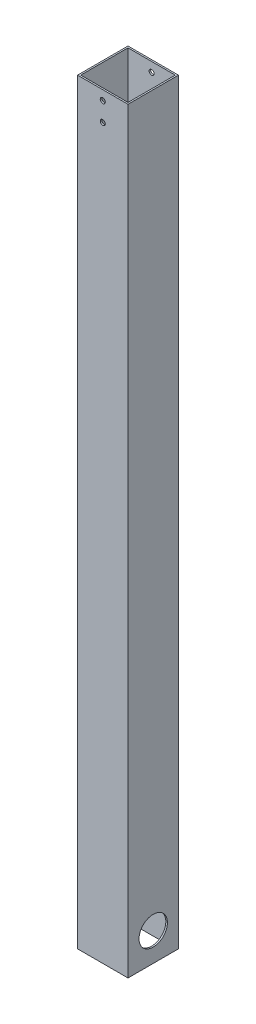
ISO-10303-21;
HEADER;
FILE_DESCRIPTION(('STEP AP214'),'2;1');
FILE_NAME('part.step','',(''),(''),'','','');
FILE_SCHEMA(('AUTOMOTIVE_DESIGN { 1 0 10303 214 1 1 1 1 }'));
ENDSEC;
DATA;
#1=APPLICATION_CONTEXT('core data for automotive mechanical design processes');
#2=APPLICATION_PROTOCOL_DEFINITION('international standard','automotive_design',2000,#1);
#3=PRODUCT_CONTEXT('',#1,'mechanical');
#4=PRODUCT('Part','Part','',(#3));
#5=PRODUCT_RELATED_PRODUCT_CATEGORY('part','',(#4));
#6=PRODUCT_DEFINITION_FORMATION('','',#4);
#7=PRODUCT_DEFINITION_CONTEXT('part definition',#1,'design');
#8=PRODUCT_DEFINITION('design','',#6,#7);
#9=PRODUCT_DEFINITION_SHAPE('','',#8);
#10=(LENGTH_UNIT() NAMED_UNIT(*) SI_UNIT(.MILLI.,.METRE.));
#11=(NAMED_UNIT(*) PLANE_ANGLE_UNIT() SI_UNIT($,.RADIAN.));
#12=(NAMED_UNIT(*) SI_UNIT($,.STERADIAN.) SOLID_ANGLE_UNIT());
#13=UNCERTAINTY_MEASURE_WITH_UNIT(LENGTH_MEASURE(1.E-05),#10,'distance_accuracy_value','');
#14=(GEOMETRIC_REPRESENTATION_CONTEXT(3) GLOBAL_UNCERTAINTY_ASSIGNED_CONTEXT((#13)) GLOBAL_UNIT_ASSIGNED_CONTEXT((#10,
#11,#12)) REPRESENTATION_CONTEXT('',''));
#15=CARTESIAN_POINT('',(0.,0.,0.));
#16=DIRECTION('',(0.,0.,1.));
#17=DIRECTION('',(1.,0.,0.));
#18=AXIS2_PLACEMENT_3D('',#15,#16,#17);
#19=CARTESIAN_POINT('',(0.,752.475,-25.4));
#20=DIRECTION('',(0.,0.,1.));
#21=DIRECTION('',(1.,0.,0.));
#22=AXIS2_PLACEMENT_3D('',#19,#20,#21);
#23=CYLINDRICAL_SURFACE('',#22,2.55270000000007);
#24=CARTESIAN_POINT('',(0.,752.475,25.4));
#25=DIRECTION('',(0.,0.,1.));
#26=DIRECTION('',(1.,0.,0.));
#27=AXIS2_PLACEMENT_3D('',#24,#25,#26);
#28=CIRCLE('',#27,2.55270000000007);
#29=CARTESIAN_POINT('',(2.55270000000007,752.475,25.4));
#30=VERTEX_POINT('',#29);
#31=EDGE_CURVE('E179',#30,#30,#28,.T.);
#32=ORIENTED_EDGE('',*,*,#31,.T.);
#33=EDGE_LOOP('',(#32));
#34=FACE_BOUND('',#33,.T.);
#35=CARTESIAN_POINT('',(0.,752.475,23.8125));
#36=DIRECTION('',(0.,0.,1.));
#37=DIRECTION('',(1.,0.,0.));
#38=AXIS2_PLACEMENT_3D('',#35,#36,#37);
#39=CIRCLE('',#38,2.55270000000007);
#40=CARTESIAN_POINT('',(2.55270000000007,752.475,23.8125));
#41=VERTEX_POINT('',#40);
#42=EDGE_CURVE('E164',#41,#41,#39,.T.);
#43=ORIENTED_EDGE('',*,*,#42,.F.);
#44=EDGE_LOOP('',(#43));
#45=FACE_BOUND('',#44,.T.);
#46=ADVANCED_FACE('F17',(#34,#45),#23,.F.);
#47=CARTESIAN_POINT('',(2.0643209364124E-13,733.425,-25.4));
#48=DIRECTION('',(0.,0.,1.));
#49=DIRECTION('',(1.,0.,0.));
#50=AXIS2_PLACEMENT_3D('',#47,#48,#49);
#51=CYLINDRICAL_SURFACE('',#50,2.55270000000007);
#52=CARTESIAN_POINT('',(2.0643209364124E-13,733.425,25.4));
#53=DIRECTION('',(0.,0.,1.));
#54=DIRECTION('',(1.,0.,0.));
#55=AXIS2_PLACEMENT_3D('',#52,#53,#54);
#56=CIRCLE('',#55,2.55270000000007);
#57=CARTESIAN_POINT('',(2.55270000000027,733.425,25.4));
#58=VERTEX_POINT('',#57);
#59=EDGE_CURVE('E174',#58,#58,#56,.T.);
#60=ORIENTED_EDGE('',*,*,#59,.T.);
#61=EDGE_LOOP('',(#60));
#62=FACE_BOUND('',#61,.T.);
#63=CARTESIAN_POINT('',(2.0643209364124E-13,733.425,23.8125));
#64=DIRECTION('',(0.,0.,1.));
#65=DIRECTION('',(1.,0.,0.));
#66=AXIS2_PLACEMENT_3D('',#63,#64,#65);
#67=CIRCLE('',#66,2.55270000000007);
#68=CARTESIAN_POINT('',(2.55270000000027,733.425,23.8125));
#69=VERTEX_POINT('',#68);
#70=EDGE_CURVE('E126',#69,#69,#67,.T.);
#71=ORIENTED_EDGE('',*,*,#70,.F.);
#72=EDGE_LOOP('',(#71));
#73=FACE_BOUND('',#72,.T.);
#74=ADVANCED_FACE('F248',(#62,#73),#51,.F.);
#75=CARTESIAN_POINT('',(25.4,28.575,0.));
#76=DIRECTION('',(-1.,0.,0.));
#77=DIRECTION('',(0.,0.,1.));
#78=AXIS2_PLACEMENT_3D('',#75,#76,#77);
#79=CYLINDRICAL_SURFACE('',#78,14.2875);
#80=CARTESIAN_POINT('',(25.4,28.575,0.));
#81=DIRECTION('',(-1.,0.,0.));
#82=DIRECTION('',(0.,0.,1.));
#83=AXIS2_PLACEMENT_3D('',#80,#81,#82);
#84=CIRCLE('',#83,14.2875);
#85=CARTESIAN_POINT('',(25.4,28.575,14.2875));
#86=VERTEX_POINT('',#85);
#87=EDGE_CURVE('E118',#86,#86,#84,.F.);
#88=ORIENTED_EDGE('',*,*,#87,.T.);
#89=EDGE_LOOP('',(#88));
#90=FACE_BOUND('',#89,.T.);
#91=CARTESIAN_POINT('',(23.8125,28.575,0.));
#92=DIRECTION('',(-1.,0.,0.));
#93=DIRECTION('',(0.,0.,1.));
#94=AXIS2_PLACEMENT_3D('',#91,#92,#93);
#95=CIRCLE('',#94,14.2875);
#96=CARTESIAN_POINT('',(23.8125,28.575,14.2875));
#97=VERTEX_POINT('',#96);
#98=EDGE_CURVE('E169',#97,#97,#95,.F.);
#99=ORIENTED_EDGE('',*,*,#98,.F.);
#100=EDGE_LOOP('',(#99));
#101=FACE_BOUND('',#100,.T.);
#102=ADVANCED_FACE('F200',(#90,#101),#79,.F.);
#103=CARTESIAN_POINT('',(25.4,28.575,0.));
#104=DIRECTION('',(-1.,0.,0.));
#105=DIRECTION('',(0.,0.,1.));
#106=AXIS2_PLACEMENT_3D('',#103,#104,#105);
#107=CYLINDRICAL_SURFACE('',#106,14.2875);
#108=CARTESIAN_POINT('',(-25.4,28.575,0.));
#109=DIRECTION('',(-1.,0.,0.));
#110=DIRECTION('',(0.,0.,1.));
#111=AXIS2_PLACEMENT_3D('',#108,#109,#110);
#112=CIRCLE('',#111,14.2875);
#113=CARTESIAN_POINT('',(-25.4,28.575,14.2875));
#114=VERTEX_POINT('',#113);
#115=EDGE_CURVE('E139',#114,#114,#112,.T.);
#116=ORIENTED_EDGE('',*,*,#115,.T.);
#117=EDGE_LOOP('',(#116));
#118=FACE_BOUND('',#117,.T.);
#119=CARTESIAN_POINT('',(-23.8125,28.575,0.));
#120=DIRECTION('',(-1.,0.,0.));
#121=DIRECTION('',(0.,0.,1.));
#122=AXIS2_PLACEMENT_3D('',#119,#120,#121);
#123=CIRCLE('',#122,14.2875);
#124=CARTESIAN_POINT('',(-23.8125,28.575,14.2875));
#125=VERTEX_POINT('',#124);
#126=EDGE_CURVE('E123',#125,#125,#123,.T.);
#127=ORIENTED_EDGE('',*,*,#126,.F.);
#128=EDGE_LOOP('',(#127));
#129=FACE_BOUND('',#128,.T.);
#130=ADVANCED_FACE('F189',(#118,#129),#107,.F.);
#131=CARTESIAN_POINT('',(-25.4,762.,25.4));
#132=DIRECTION('',(0.,0.,-1.));
#133=DIRECTION('',(-1.,0.,0.));
#134=AXIS2_PLACEMENT_3D('',#131,#132,#133);
#135=PLANE('',#134);
#136=DIRECTION('',(0.,1.,0.));
#137=VECTOR('',#136,1.);
#138=CARTESIAN_POINT('',(25.4,762.,25.4));
#139=LINE('',#138,#137);
#140=CARTESIAN_POINT('',(25.4,0.,25.4));
#141=VERTEX_POINT('',#140);
#142=CARTESIAN_POINT('',(25.4,762.,25.4));
#143=VERTEX_POINT('',#142);
#144=EDGE_CURVE('E116',#141,#143,#139,.T.);
#145=ORIENTED_EDGE('',*,*,#144,.T.);
#146=DIRECTION('',(1.,0.,0.));
#147=VECTOR('',#146,1.);
#148=CARTESIAN_POINT('',(0.,762.,25.4));
#149=LINE('',#148,#147);
#150=CARTESIAN_POINT('',(-25.4,762.,25.4));
#151=VERTEX_POINT('',#150);
#152=EDGE_CURVE('E90',#151,#143,#149,.T.);
#153=ORIENTED_EDGE('',*,*,#152,.F.);
#154=DIRECTION('',(0.,1.,0.));
#155=VECTOR('',#154,1.);
#156=CARTESIAN_POINT('',(-25.4,762.,25.4));
#157=LINE('',#156,#155);
#158=CARTESIAN_POINT('',(-25.4,0.,25.4));
#159=VERTEX_POINT('',#158);
#160=EDGE_CURVE('E369',#151,#159,#157,.F.);
#161=ORIENTED_EDGE('',*,*,#160,.T.);
#162=DIRECTION('',(1.,0.,0.));
#163=VECTOR('',#162,1.);
#164=CARTESIAN_POINT('',(0.,0.,25.4));
#165=LINE('',#164,#163);
#166=EDGE_CURVE('E372',#159,#141,#165,.T.);
#167=ORIENTED_EDGE('',*,*,#166,.T.);
#168=EDGE_LOOP('',(#145,#153,#161,#167));
#169=FACE_BOUND('',#168,.T.);
#170=ORIENTED_EDGE('',*,*,#59,.F.);
#171=EDGE_LOOP('',(#170));
#172=FACE_BOUND('',#171,.T.);
#173=ORIENTED_EDGE('',*,*,#31,.F.);
#174=EDGE_LOOP('',(#173));
#175=FACE_BOUND('',#174,.T.);
#176=ADVANCED_FACE('F186',(#169,#172,#175),#135,.F.);
#177=CARTESIAN_POINT('',(23.8125,762.,-23.8125));
#178=DIRECTION('',(-1.,0.,0.));
#179=DIRECTION('',(0.,0.,1.));
#180=AXIS2_PLACEMENT_3D('',#177,#178,#179);
#181=PLANE('',#180);
#182=DIRECTION('',(0.,0.,1.));
#183=VECTOR('',#182,1.);
#184=CARTESIAN_POINT('',(23.8125,762.,0.));
#185=LINE('',#184,#183);
#186=CARTESIAN_POINT('',(23.8125,762.,-23.8125));
#187=VERTEX_POINT('',#186);
#188=CARTESIAN_POINT('',(23.8125,762.,23.8125));
#189=VERTEX_POINT('',#188);
#190=EDGE_CURVE('E107',#187,#189,#185,.T.);
#191=ORIENTED_EDGE('',*,*,#190,.F.);
#192=DIRECTION('',(0.,1.,0.));
#193=VECTOR('',#192,1.);
#194=CARTESIAN_POINT('',(23.8125,762.,-23.8125));
#195=LINE('',#194,#193);
#196=CARTESIAN_POINT('',(23.8125,0.,-23.8125));
#197=VERTEX_POINT('',#196);
#198=EDGE_CURVE('E102',#197,#187,#195,.T.);
#199=ORIENTED_EDGE('',*,*,#198,.F.);
#200=DIRECTION('',(0.,0.,1.));
#201=VECTOR('',#200,1.);
#202=CARTESIAN_POINT('',(23.8125,0.,0.));
#203=LINE('',#202,#201);
#204=CARTESIAN_POINT('',(23.8125,0.,23.8125));
#205=VERTEX_POINT('',#204);
#206=EDGE_CURVE('E378',#197,#205,#203,.T.);
#207=ORIENTED_EDGE('',*,*,#206,.T.);
#208=DIRECTION('',(0.,1.,0.));
#209=VECTOR('',#208,1.);
#210=CARTESIAN_POINT('',(23.8125,762.,23.8125));
#211=LINE('',#210,#209);
#212=EDGE_CURVE('E124',#189,#205,#211,.F.);
#213=ORIENTED_EDGE('',*,*,#212,.F.);
#214=EDGE_LOOP('',(#191,#199,#207,#213));
#215=FACE_BOUND('',#214,.T.);
#216=ORIENTED_EDGE('',*,*,#98,.T.);
#217=EDGE_LOOP('',(#216));
#218=FACE_BOUND('',#217,.T.);
#219=ADVANCED_FACE('F188',(#215,#218),#181,.T.);
#220=CARTESIAN_POINT('',(-23.8125,762.,23.8125));
#221=DIRECTION('',(0.,0.,-1.));
#222=DIRECTION('',(-1.,0.,0.));
#223=AXIS2_PLACEMENT_3D('',#220,#221,#222);
#224=PLANE('',#223);
#225=DIRECTION('',(1.,0.,0.));
#226=VECTOR('',#225,1.);
#227=CARTESIAN_POINT('',(0.,762.,23.8125));
#228=LINE('',#227,#226);
#229=CARTESIAN_POINT('',(-23.8125,762.,23.8125));
#230=VERTEX_POINT('',#229);
#231=EDGE_CURVE('E88',#189,#230,#228,.F.);
#232=ORIENTED_EDGE('',*,*,#231,.F.);
#233=ORIENTED_EDGE('',*,*,#212,.T.);
#234=DIRECTION('',(1.,0.,0.));
#235=VECTOR('',#234,1.);
#236=CARTESIAN_POINT('',(0.,0.,23.8125));
#237=LINE('',#236,#235);
#238=CARTESIAN_POINT('',(-23.8125,0.,23.8125));
#239=VERTEX_POINT('',#238);
#240=EDGE_CURVE('E381',#205,#239,#237,.F.);
#241=ORIENTED_EDGE('',*,*,#240,.T.);
#242=DIRECTION('',(0.,1.,0.));
#243=VECTOR('',#242,1.);
#244=CARTESIAN_POINT('',(-23.8125,762.,23.8125));
#245=LINE('',#244,#243);
#246=EDGE_CURVE('E121',#230,#239,#245,.F.);
#247=ORIENTED_EDGE('',*,*,#246,.F.);
#248=EDGE_LOOP('',(#232,#233,#241,#247));
#249=FACE_BOUND('',#248,.T.);
#250=ORIENTED_EDGE('',*,*,#70,.T.);
#251=EDGE_LOOP('',(#250));
#252=FACE_BOUND('',#251,.T.);
#253=ORIENTED_EDGE('',*,*,#42,.T.);
#254=EDGE_LOOP('',(#253));
#255=FACE_BOUND('',#254,.T.);
#256=ADVANCED_FACE('F197',(#249,#252,#255),#224,.T.);
#257=CARTESIAN_POINT('',(-23.8125,762.,-23.8125));
#258=DIRECTION('',(1.,0.,0.));
#259=DIRECTION('',(0.,0.,-1.));
#260=AXIS2_PLACEMENT_3D('',#257,#258,#259);
#261=PLANE('',#260);
#262=DIRECTION('',(0.,0.,1.));
#263=VECTOR('',#262,1.);
#264=CARTESIAN_POINT('',(-23.8125,762.,0.));
#265=LINE('',#264,#263);
#266=CARTESIAN_POINT('',(-23.8125,762.,-23.8125));
#267=VERTEX_POINT('',#266);
#268=EDGE_CURVE('E80',#230,#267,#265,.F.);
#269=ORIENTED_EDGE('',*,*,#268,.F.);
#270=ORIENTED_EDGE('',*,*,#246,.T.);
#271=DIRECTION('',(0.,0.,1.));
#272=VECTOR('',#271,1.);
#273=CARTESIAN_POINT('',(-23.8125,0.,0.));
#274=LINE('',#273,#272);
#275=CARTESIAN_POINT('',(-23.8125,0.,-23.8125));
#276=VERTEX_POINT('',#275);
#277=EDGE_CURVE('E97',#239,#276,#274,.F.);
#278=ORIENTED_EDGE('',*,*,#277,.T.);
#279=DIRECTION('',(0.,1.,0.));
#280=VECTOR('',#279,1.);
#281=CARTESIAN_POINT('',(-23.8125,762.,-23.8125));
#282=LINE('',#281,#280);
#283=EDGE_CURVE('E93',#267,#276,#282,.F.);
#284=ORIENTED_EDGE('',*,*,#283,.F.);
#285=EDGE_LOOP('',(#269,#270,#278,#284));
#286=FACE_BOUND('',#285,.T.);
#287=ORIENTED_EDGE('',*,*,#126,.T.);
#288=EDGE_LOOP('',(#287));
#289=FACE_BOUND('',#288,.T.);
#290=ADVANCED_FACE('F94',(#286,#289),#261,.T.);
#291=CARTESIAN_POINT('',(-23.8125,762.,-23.8125));
#292=DIRECTION('',(0.,0.,1.));
#293=DIRECTION('',(1.,0.,0.));
#294=AXIS2_PLACEMENT_3D('',#291,#292,#293);
#295=PLANE('',#294);
#296=DIRECTION('',(1.,0.,0.));
#297=VECTOR('',#296,1.);
#298=CARTESIAN_POINT('',(0.,762.,-23.8125));
#299=LINE('',#298,#297);
#300=EDGE_CURVE('E85',#267,#187,#299,.T.);
#301=ORIENTED_EDGE('',*,*,#300,.F.);
#302=ORIENTED_EDGE('',*,*,#283,.T.);
#303=DIRECTION('',(1.,0.,0.));
#304=VECTOR('',#303,1.);
#305=CARTESIAN_POINT('',(0.,0.,-23.8125));
#306=LINE('',#305,#304);
#307=EDGE_CURVE('E136',#276,#197,#306,.T.);
#308=ORIENTED_EDGE('',*,*,#307,.T.);
#309=ORIENTED_EDGE('',*,*,#198,.T.);
#310=EDGE_LOOP('',(#301,#302,#308,#309));
#311=FACE_BOUND('',#310,.T.);
#312=CARTESIAN_POINT('',(2.0643209364124E-13,733.425,-23.8125));
#313=DIRECTION('',(0.,0.,1.));
#314=DIRECTION('',(1.,0.,0.));
#315=AXIS2_PLACEMENT_3D('',#312,#313,#314);
#316=CIRCLE('',#315,2.55270000000007);
#317=CARTESIAN_POINT('',(2.55270000000027,733.425,-23.8125));
#318=VERTEX_POINT('',#317);
#319=EDGE_CURVE('E147',#318,#318,#316,.F.);
#320=ORIENTED_EDGE('',*,*,#319,.T.);
#321=EDGE_LOOP('',(#320));
#322=FACE_BOUND('',#321,.T.);
#323=CARTESIAN_POINT('',(0.,752.475,-23.8125));
#324=DIRECTION('',(0.,0.,1.));
#325=DIRECTION('',(1.,0.,0.));
#326=AXIS2_PLACEMENT_3D('',#323,#324,#325);
#327=CIRCLE('',#326,2.55270000000007);
#328=CARTESIAN_POINT('',(2.55270000000007,752.475,-23.8125));
#329=VERTEX_POINT('',#328);
#330=EDGE_CURVE('E101',#329,#329,#327,.F.);
#331=ORIENTED_EDGE('',*,*,#330,.T.);
#332=EDGE_LOOP('',(#331));
#333=FACE_BOUND('',#332,.T.);
#334=ADVANCED_FACE('F104',(#311,#322,#333),#295,.T.);
#335=CARTESIAN_POINT('',(0.,752.475,-25.4));
#336=DIRECTION('',(0.,0.,1.));
#337=DIRECTION('',(1.,0.,0.));
#338=AXIS2_PLACEMENT_3D('',#335,#336,#337);
#339=CYLINDRICAL_SURFACE('',#338,2.55270000000007);
#340=CARTESIAN_POINT('',(0.,752.475,-25.4));
#341=DIRECTION('',(0.,0.,1.));
#342=DIRECTION('',(1.,0.,0.));
#343=AXIS2_PLACEMENT_3D('',#340,#341,#342);
#344=CIRCLE('',#343,2.55270000000007);
#345=CARTESIAN_POINT('',(2.55270000000007,752.475,-25.4));
#346=VERTEX_POINT('',#345);
#347=EDGE_CURVE('E131',#346,#346,#344,.F.);
#348=ORIENTED_EDGE('',*,*,#347,.T.);
#349=EDGE_LOOP('',(#348));
#350=FACE_BOUND('',#349,.T.);
#351=ORIENTED_EDGE('',*,*,#330,.F.);
#352=EDGE_LOOP('',(#351));
#353=FACE_BOUND('',#352,.T.);
#354=ADVANCED_FACE('F230',(#350,#353),#339,.F.);
#355=CARTESIAN_POINT('',(2.0643209364124E-13,733.425,-25.4));
#356=DIRECTION('',(0.,0.,1.));
#357=DIRECTION('',(1.,0.,0.));
#358=AXIS2_PLACEMENT_3D('',#355,#356,#357);
#359=CYLINDRICAL_SURFACE('',#358,2.55270000000007);
#360=CARTESIAN_POINT('',(2.0643209364124E-13,733.425,-25.4));
#361=DIRECTION('',(0.,0.,1.));
#362=DIRECTION('',(1.,0.,0.));
#363=AXIS2_PLACEMENT_3D('',#360,#361,#362);
#364=CIRCLE('',#363,2.55270000000007);
#365=CARTESIAN_POINT('',(2.55270000000027,733.425,-25.4));
#366=VERTEX_POINT('',#365);
#367=EDGE_CURVE('E127',#366,#366,#364,.F.);
#368=ORIENTED_EDGE('',*,*,#367,.T.);
#369=EDGE_LOOP('',(#368));
#370=FACE_BOUND('',#369,.T.);
#371=ORIENTED_EDGE('',*,*,#319,.F.);
#372=EDGE_LOOP('',(#371));
#373=FACE_BOUND('',#372,.T.);
#374=ADVANCED_FACE('F226',(#370,#373),#359,.F.);
#375=CARTESIAN_POINT('',(25.4,762.,-25.4));
#376=DIRECTION('',(-1.,0.,0.));
#377=DIRECTION('',(0.,0.,1.));
#378=AXIS2_PLACEMENT_3D('',#375,#376,#377);
#379=PLANE('',#378);
#380=DIRECTION('',(0.,1.,0.));
#381=VECTOR('',#380,1.);
#382=CARTESIAN_POINT('',(25.4,762.,-25.4));
#383=LINE('',#382,#381);
#384=CARTESIAN_POINT('',(25.4,0.,-25.4));
#385=VERTEX_POINT('',#384);
#386=CARTESIAN_POINT('',(25.4,762.,-25.4));
#387=VERTEX_POINT('',#386);
#388=EDGE_CURVE('E130',#385,#387,#383,.T.);
#389=ORIENTED_EDGE('',*,*,#388,.T.);
#390=DIRECTION('',(0.,0.,1.));
#391=VECTOR('',#390,1.);
#392=CARTESIAN_POINT('',(25.4,762.,0.));
#393=LINE('',#392,#391);
#394=EDGE_CURVE('E114',#143,#387,#393,.F.);
#395=ORIENTED_EDGE('',*,*,#394,.F.);
#396=ORIENTED_EDGE('',*,*,#144,.F.);
#397=DIRECTION('',(0.,0.,1.));
#398=VECTOR('',#397,1.);
#399=CARTESIAN_POINT('',(25.4,0.,0.));
#400=LINE('',#399,#398);
#401=EDGE_CURVE('E375',#141,#385,#400,.F.);
#402=ORIENTED_EDGE('',*,*,#401,.T.);
#403=EDGE_LOOP('',(#389,#395,#396,#402));
#404=FACE_BOUND('',#403,.T.);
#405=ORIENTED_EDGE('',*,*,#87,.F.);
#406=EDGE_LOOP('',(#405));
#407=FACE_BOUND('',#406,.T.);
#408=ADVANCED_FACE('F223',(#404,#407),#379,.F.);
#409=CARTESIAN_POINT('',(0.,762.,0.));
#410=DIRECTION('',(0.,1.,0.));
#411=DIRECTION('',(0.,0.,1.));
#412=AXIS2_PLACEMENT_3D('',#409,#410,#411);
#413=PLANE('',#412);
#414=ORIENTED_EDGE('',*,*,#190,.T.);
#415=ORIENTED_EDGE('',*,*,#231,.T.);
#416=ORIENTED_EDGE('',*,*,#268,.T.);
#417=ORIENTED_EDGE('',*,*,#300,.T.);
#418=EDGE_LOOP('',(#414,#415,#416,#417));
#419=FACE_BOUND('',#418,.T.);
#420=DIRECTION('',(0.,0.,-1.));
#421=VECTOR('',#420,1.);
#422=CARTESIAN_POINT('',(-25.4,762.,-25.4));
#423=LINE('',#422,#421);
#424=CARTESIAN_POINT('',(-25.4,762.,-25.4));
#425=VERTEX_POINT('',#424);
#426=EDGE_CURVE('E142',#425,#151,#423,.F.);
#427=ORIENTED_EDGE('',*,*,#426,.T.);
#428=ORIENTED_EDGE('',*,*,#152,.T.);
#429=ORIENTED_EDGE('',*,*,#394,.T.);
#430=DIRECTION('',(1.,0.,0.));
#431=VECTOR('',#430,1.);
#432=CARTESIAN_POINT('',(-25.4,762.,-25.4));
#433=LINE('',#432,#431);
#434=EDGE_CURVE('E387',#387,#425,#433,.F.);
#435=ORIENTED_EDGE('',*,*,#434,.T.);
#436=EDGE_LOOP('',(#427,#428,#429,#435));
#437=FACE_BOUND('',#436,.T.);
#438=ADVANCED_FACE('F82',(#419,#437),#413,.T.);
#439=CARTESIAN_POINT('',(-25.4,762.,-25.4));
#440=DIRECTION('',(1.,0.,0.));
#441=DIRECTION('',(0.,0.,-1.));
#442=AXIS2_PLACEMENT_3D('',#439,#440,#441);
#443=PLANE('',#442);
#444=ORIENTED_EDGE('',*,*,#160,.F.);
#445=ORIENTED_EDGE('',*,*,#426,.F.);
#446=DIRECTION('',(0.,1.,0.));
#447=VECTOR('',#446,1.);
#448=CARTESIAN_POINT('',(-25.4,762.,-25.4));
#449=LINE('',#448,#447);
#450=CARTESIAN_POINT('',(-25.4,0.,-25.4));
#451=VERTEX_POINT('',#450);
#452=EDGE_CURVE('E26',#425,#451,#449,.F.);
#453=ORIENTED_EDGE('',*,*,#452,.T.);
#454=DIRECTION('',(0.,0.,1.));
#455=VECTOR('',#454,1.);
#456=CARTESIAN_POINT('',(-25.4,0.,0.));
#457=LINE('',#456,#455);
#458=EDGE_CURVE('E34',#451,#159,#457,.T.);
#459=ORIENTED_EDGE('',*,*,#458,.T.);
#460=EDGE_LOOP('',(#444,#445,#453,#459));
#461=FACE_BOUND('',#460,.T.);
#462=ORIENTED_EDGE('',*,*,#115,.F.);
#463=EDGE_LOOP('',(#462));
#464=FACE_BOUND('',#463,.T.);
#465=ADVANCED_FACE('F212',(#461,#464),#443,.F.);
#466=CARTESIAN_POINT('',(0.,0.,0.));
#467=DIRECTION('',(0.,1.,0.));
#468=DIRECTION('',(0.,0.,1.));
#469=AXIS2_PLACEMENT_3D('',#466,#467,#468);
#470=PLANE('',#469);
#471=ORIENTED_EDGE('',*,*,#277,.F.);
#472=ORIENTED_EDGE('',*,*,#240,.F.);
#473=ORIENTED_EDGE('',*,*,#206,.F.);
#474=ORIENTED_EDGE('',*,*,#307,.F.);
#475=EDGE_LOOP('',(#471,#472,#473,#474));
#476=FACE_BOUND('',#475,.T.);
#477=ORIENTED_EDGE('',*,*,#166,.F.);
#478=ORIENTED_EDGE('',*,*,#458,.F.);
#479=DIRECTION('',(1.,0.,0.));
#480=VECTOR('',#479,1.);
#481=CARTESIAN_POINT('',(-25.4,0.,-25.4));
#482=LINE('',#481,#480);
#483=EDGE_CURVE('E11',#451,#385,#482,.T.);
#484=ORIENTED_EDGE('',*,*,#483,.T.);
#485=ORIENTED_EDGE('',*,*,#401,.F.);
#486=EDGE_LOOP('',(#477,#478,#484,#485));
#487=FACE_BOUND('',#486,.T.);
#488=ADVANCED_FACE('F206',(#476,#487),#470,.F.);
#489=CARTESIAN_POINT('',(-25.4,762.,-25.4));
#490=DIRECTION('',(0.,0.,1.));
#491=DIRECTION('',(1.,0.,0.));
#492=AXIS2_PLACEMENT_3D('',#489,#490,#491);
#493=PLANE('',#492);
#494=ORIENTED_EDGE('',*,*,#452,.F.);
#495=ORIENTED_EDGE('',*,*,#434,.F.);
#496=ORIENTED_EDGE('',*,*,#388,.F.);
#497=ORIENTED_EDGE('',*,*,#483,.F.);
#498=EDGE_LOOP('',(#494,#495,#496,#497));
#499=FACE_BOUND('',#498,.T.);
#500=ORIENTED_EDGE('',*,*,#367,.F.);
#501=EDGE_LOOP('',(#500));
#502=FACE_BOUND('',#501,.T.);
#503=ORIENTED_EDGE('',*,*,#347,.F.);
#504=EDGE_LOOP('',(#503));
#505=FACE_BOUND('',#504,.T.);
#506=ADVANCED_FACE('F204',(#499,#502,#505),#493,.F.);
#507=CLOSED_SHELL('',(#46,#74,#102,#130,#176,#219,#256,#290,#334,#354,#374,#408,#438,#465,#488,#506));
#508=MANIFOLD_SOLID_BREP('B1',#507);
#509=ADVANCED_BREP_SHAPE_REPRESENTATION('',(#18,#508),#14);
#510=SHAPE_DEFINITION_REPRESENTATION(#9,#509);
ENDSEC;
END-ISO-10303-21;
